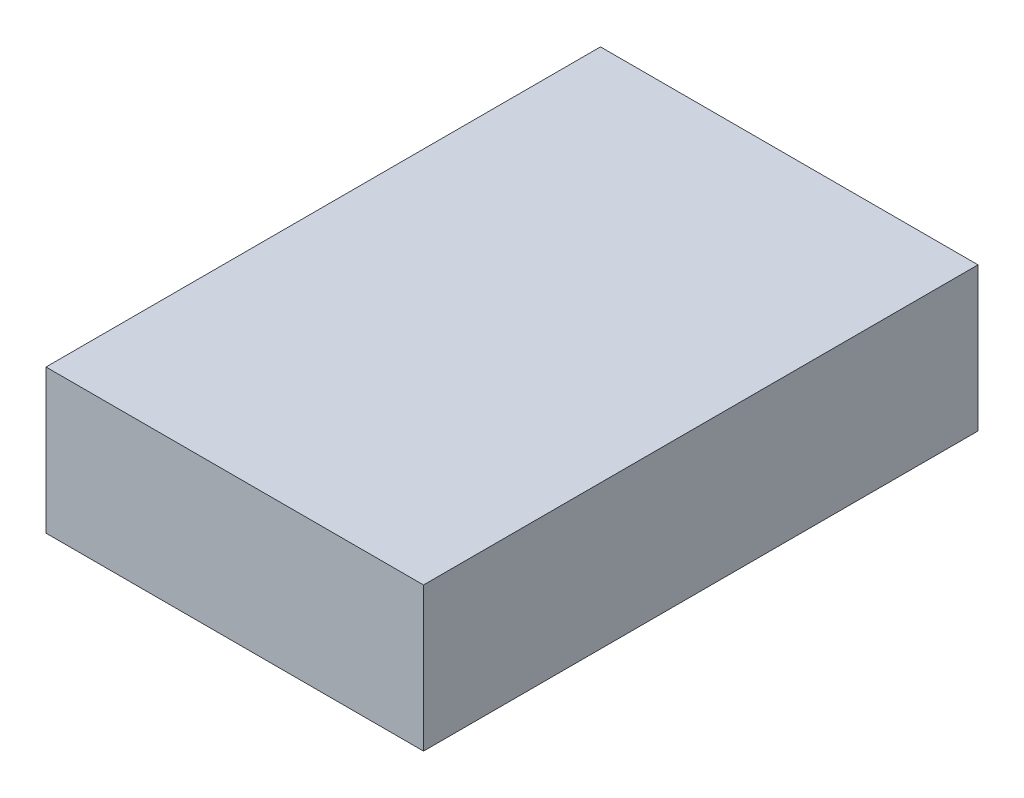
ISO-10303-21;
HEADER;
FILE_DESCRIPTION(('STEP AP214'),'2;1');
FILE_NAME('part.step','',(''),(''),'','','');
FILE_SCHEMA(('AUTOMOTIVE_DESIGN { 1 0 10303 214 1 1 1 1 }'));
ENDSEC;
DATA;
#1=APPLICATION_CONTEXT('core data for automotive mechanical design processes');
#2=APPLICATION_PROTOCOL_DEFINITION('international standard','automotive_design',2000,#1);
#3=PRODUCT_CONTEXT('',#1,'mechanical');
#4=PRODUCT('Part','Part','',(#3));
#5=PRODUCT_RELATED_PRODUCT_CATEGORY('part','',(#4));
#6=PRODUCT_DEFINITION_FORMATION('','',#4);
#7=PRODUCT_DEFINITION_CONTEXT('part definition',#1,'design');
#8=PRODUCT_DEFINITION('design','',#6,#7);
#9=PRODUCT_DEFINITION_SHAPE('','',#8);
#10=(LENGTH_UNIT() NAMED_UNIT(*) SI_UNIT(.MILLI.,.METRE.));
#11=(NAMED_UNIT(*) PLANE_ANGLE_UNIT() SI_UNIT($,.RADIAN.));
#12=(NAMED_UNIT(*) SI_UNIT($,.STERADIAN.) SOLID_ANGLE_UNIT());
#13=UNCERTAINTY_MEASURE_WITH_UNIT(LENGTH_MEASURE(1.E-05),#10,'distance_accuracy_value','');
#14=(GEOMETRIC_REPRESENTATION_CONTEXT(3) GLOBAL_UNCERTAINTY_ASSIGNED_CONTEXT((#13)) GLOBAL_UNIT_ASSIGNED_CONTEXT((#10,
#11,#12)) REPRESENTATION_CONTEXT('',''));
#15=CARTESIAN_POINT('',(0.,0.,0.));
#16=DIRECTION('',(0.,0.,1.));
#17=DIRECTION('',(1.,0.,0.));
#18=AXIS2_PLACEMENT_3D('',#15,#16,#17);
#19=CARTESIAN_POINT('',(16.,12.2,23.5));
#20=DIRECTION('',(-1.,0.,0.));
#21=DIRECTION('',(0.,0.,1.));
#22=AXIS2_PLACEMENT_3D('',#19,#20,#21);
#23=PLANE('',#22);
#24=DIRECTION('',(0.,0.,-1.));
#25=VECTOR('',#24,1.);
#26=CARTESIAN_POINT('',(16.,0.,23.5));
#27=LINE('',#26,#25);
#28=CARTESIAN_POINT('',(16.,0.,23.5));
#29=VERTEX_POINT('',#28);
#30=CARTESIAN_POINT('',(16.,0.,-23.5));
#31=VERTEX_POINT('',#30);
#32=EDGE_CURVE('E100',#29,#31,#27,.T.);
#33=ORIENTED_EDGE('',*,*,#32,.T.);
#34=DIRECTION('',(0.,-1.,0.));
#35=VECTOR('',#34,1.);
#36=CARTESIAN_POINT('',(16.,12.2,-23.5));
#37=LINE('',#36,#35);
#38=CARTESIAN_POINT('',(16.,12.2,-23.5));
#39=VERTEX_POINT('',#38);
#40=EDGE_CURVE('E11',#39,#31,#37,.T.);
#41=ORIENTED_EDGE('',*,*,#40,.F.);
#42=DIRECTION('',(0.,0.,-1.));
#43=VECTOR('',#42,1.);
#44=CARTESIAN_POINT('',(16.,12.2,23.5));
#45=LINE('',#44,#43);
#46=CARTESIAN_POINT('',(16.,12.2,23.5));
#47=VERTEX_POINT('',#46);
#48=EDGE_CURVE('E88',#47,#39,#45,.T.);
#49=ORIENTED_EDGE('',*,*,#48,.F.);
#50=DIRECTION('',(0.,-1.,0.));
#51=VECTOR('',#50,1.);
#52=CARTESIAN_POINT('',(16.,12.2,23.5));
#53=LINE('',#52,#51);
#54=EDGE_CURVE('E96',#47,#29,#53,.T.);
#55=ORIENTED_EDGE('',*,*,#54,.T.);
#56=EDGE_LOOP('',(#33,#41,#49,#55));
#57=FACE_BOUND('',#56,.T.);
#58=ADVANCED_FACE('F37',(#57),#23,.F.);
#59=CARTESIAN_POINT('',(-16.,12.2,-23.5));
#60=DIRECTION('',(0.,0.,1.));
#61=DIRECTION('',(1.,0.,0.));
#62=AXIS2_PLACEMENT_3D('',#59,#60,#61);
#63=PLANE('',#62);
#64=DIRECTION('',(-1.,0.,0.));
#65=VECTOR('',#64,1.);
#66=CARTESIAN_POINT('',(-16.,0.,-23.5));
#67=LINE('',#66,#65);
#68=CARTESIAN_POINT('',(-16.,0.,-23.5));
#69=VERTEX_POINT('',#68);
#70=EDGE_CURVE('E92',#31,#69,#67,.T.);
#71=ORIENTED_EDGE('',*,*,#70,.T.);
#72=DIRECTION('',(0.,-1.,0.));
#73=VECTOR('',#72,1.);
#74=CARTESIAN_POINT('',(-16.,12.2,-23.5));
#75=LINE('',#74,#73);
#76=CARTESIAN_POINT('',(-16.,12.2,-23.5));
#77=VERTEX_POINT('',#76);
#78=EDGE_CURVE('E45',#77,#69,#75,.T.);
#79=ORIENTED_EDGE('',*,*,#78,.F.);
#80=DIRECTION('',(-1.,0.,0.));
#81=VECTOR('',#80,1.);
#82=CARTESIAN_POINT('',(-16.,12.2,-23.5));
#83=LINE('',#82,#81);
#84=EDGE_CURVE('E83',#39,#77,#83,.T.);
#85=ORIENTED_EDGE('',*,*,#84,.F.);
#86=ORIENTED_EDGE('',*,*,#40,.T.);
#87=EDGE_LOOP('',(#71,#79,#85,#86));
#88=FACE_BOUND('',#87,.T.);
#89=ADVANCED_FACE('F91',(#88),#63,.F.);
#90=CARTESIAN_POINT('',(-16.,12.2,23.5));
#91=DIRECTION('',(1.,0.,0.));
#92=DIRECTION('',(0.,0.,-1.));
#93=AXIS2_PLACEMENT_3D('',#90,#91,#92);
#94=PLANE('',#93);
#95=DIRECTION('',(0.,0.,1.));
#96=VECTOR('',#95,1.);
#97=CARTESIAN_POINT('',(-16.,0.,23.5));
#98=LINE('',#97,#96);
#99=CARTESIAN_POINT('',(-16.,0.,23.5));
#100=VERTEX_POINT('',#99);
#101=EDGE_CURVE('E70',#69,#100,#98,.T.);
#102=ORIENTED_EDGE('',*,*,#101,.T.);
#103=DIRECTION('',(0.,-1.,0.));
#104=VECTOR('',#103,1.);
#105=CARTESIAN_POINT('',(-16.,12.2,23.5));
#106=LINE('',#105,#104);
#107=CARTESIAN_POINT('',(-16.,12.2,23.5));
#108=VERTEX_POINT('',#107);
#109=EDGE_CURVE('E93',#108,#100,#106,.T.);
#110=ORIENTED_EDGE('',*,*,#109,.F.);
#111=DIRECTION('',(0.,0.,1.));
#112=VECTOR('',#111,1.);
#113=CARTESIAN_POINT('',(-16.,12.2,23.5));
#114=LINE('',#113,#112);
#115=EDGE_CURVE('E86',#77,#108,#114,.T.);
#116=ORIENTED_EDGE('',*,*,#115,.F.);
#117=ORIENTED_EDGE('',*,*,#78,.T.);
#118=EDGE_LOOP('',(#102,#110,#116,#117));
#119=FACE_BOUND('',#118,.T.);
#120=ADVANCED_FACE('F94',(#119),#94,.F.);
#121=CARTESIAN_POINT('',(-16.,12.2,23.5));
#122=DIRECTION('',(0.,0.,-1.));
#123=DIRECTION('',(-1.,0.,0.));
#124=AXIS2_PLACEMENT_3D('',#121,#122,#123);
#125=PLANE('',#124);
#126=DIRECTION('',(1.,0.,0.));
#127=VECTOR('',#126,1.);
#128=CARTESIAN_POINT('',(-16.,0.,23.5));
#129=LINE('',#128,#127);
#130=EDGE_CURVE('E76',#100,#29,#129,.T.);
#131=ORIENTED_EDGE('',*,*,#130,.T.);
#132=ORIENTED_EDGE('',*,*,#54,.F.);
#133=DIRECTION('',(1.,0.,0.));
#134=VECTOR('',#133,1.);
#135=CARTESIAN_POINT('',(-16.,12.2,23.5));
#136=LINE('',#135,#134);
#137=EDGE_CURVE('E53',#108,#47,#136,.T.);
#138=ORIENTED_EDGE('',*,*,#137,.F.);
#139=ORIENTED_EDGE('',*,*,#109,.T.);
#140=EDGE_LOOP('',(#131,#132,#138,#139));
#141=FACE_BOUND('',#140,.T.);
#142=ADVANCED_FACE('F107',(#141),#125,.F.);
#143=CARTESIAN_POINT('',(0.,12.2,0.));
#144=DIRECTION('',(0.,-1.,0.));
#145=DIRECTION('',(0.,0.,-1.));
#146=AXIS2_PLACEMENT_3D('',#143,#144,#145);
#147=PLANE('',#146);
#148=ORIENTED_EDGE('',*,*,#48,.T.);
#149=ORIENTED_EDGE('',*,*,#84,.T.);
#150=ORIENTED_EDGE('',*,*,#115,.T.);
#151=ORIENTED_EDGE('',*,*,#137,.T.);
#152=EDGE_LOOP('',(#148,#149,#150,#151));
#153=FACE_BOUND('',#152,.T.);
#154=ADVANCED_FACE('F84',(#153),#147,.F.);
#155=CARTESIAN_POINT('',(0.,0.,0.));
#156=DIRECTION('',(0.,-1.,0.));
#157=DIRECTION('',(0.,0.,-1.));
#158=AXIS2_PLACEMENT_3D('',#155,#156,#157);
#159=PLANE('',#158);
#160=ORIENTED_EDGE('',*,*,#32,.F.);
#161=ORIENTED_EDGE('',*,*,#130,.F.);
#162=ORIENTED_EDGE('',*,*,#101,.F.);
#163=ORIENTED_EDGE('',*,*,#70,.F.);
#164=EDGE_LOOP('',(#160,#161,#162,#163));
#165=FACE_BOUND('',#164,.T.);
#166=ADVANCED_FACE('F110',(#165),#159,.T.);
#167=CLOSED_SHELL('',(#58,#89,#120,#142,#154,#166));
#168=MANIFOLD_SOLID_BREP('B2',#167);
#169=ADVANCED_BREP_SHAPE_REPRESENTATION('',(#18,#168),#14);
#170=SHAPE_DEFINITION_REPRESENTATION(#9,#169);
ENDSEC;
END-ISO-10303-21;
